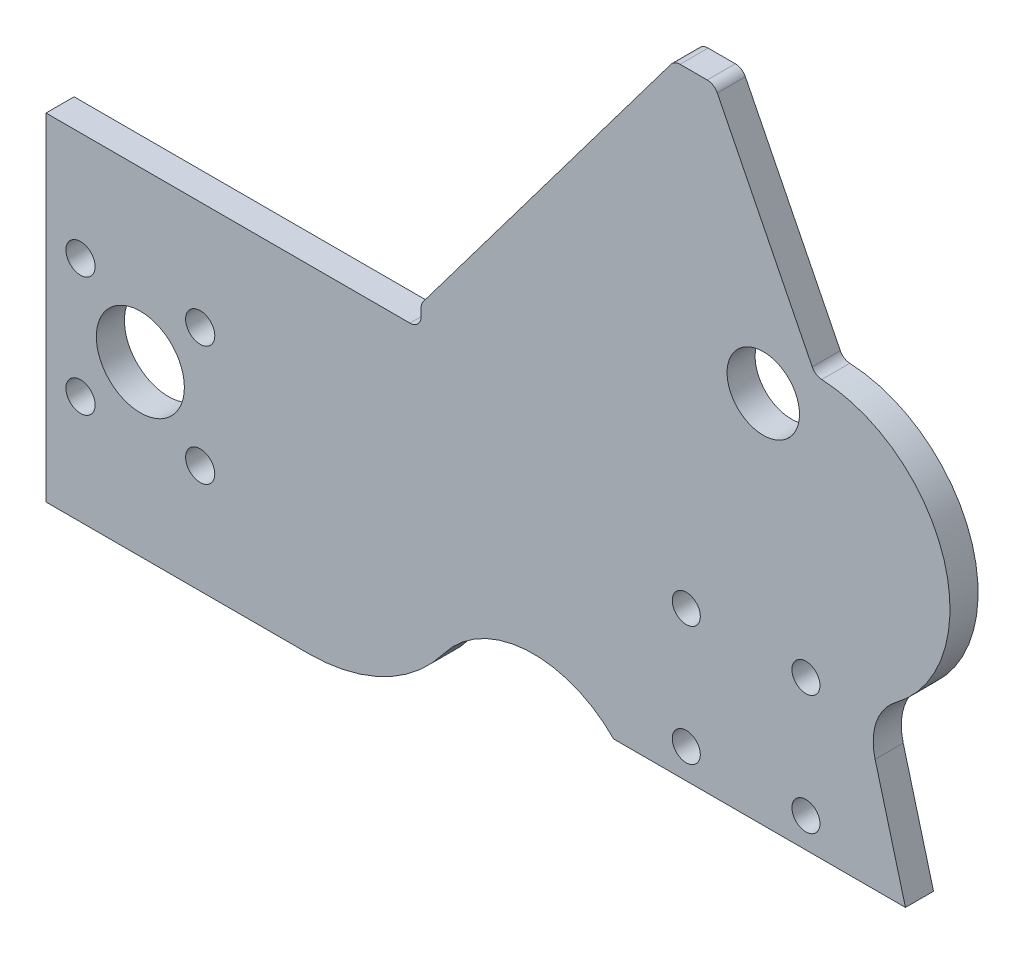
ISO-10303-21;
HEADER;
FILE_DESCRIPTION(('STEP AP214'),'2;1');
FILE_NAME('part.step','',(''),(''),'','','');
FILE_SCHEMA(('AUTOMOTIVE_DESIGN { 1 0 10303 214 1 1 1 1 }'));
ENDSEC;
DATA;
#1=APPLICATION_CONTEXT('core data for automotive mechanical design processes');
#2=APPLICATION_PROTOCOL_DEFINITION('international standard','automotive_design',2000,#1);
#3=PRODUCT_CONTEXT('',#1,'mechanical');
#4=PRODUCT('Part','Part','',(#3));
#5=PRODUCT_RELATED_PRODUCT_CATEGORY('part','',(#4));
#6=PRODUCT_DEFINITION_FORMATION('','',#4);
#7=PRODUCT_DEFINITION_CONTEXT('part definition',#1,'design');
#8=PRODUCT_DEFINITION('design','',#6,#7);
#9=PRODUCT_DEFINITION_SHAPE('','',#8);
#10=(LENGTH_UNIT() NAMED_UNIT(*) SI_UNIT(.MILLI.,.METRE.));
#11=(NAMED_UNIT(*) PLANE_ANGLE_UNIT() SI_UNIT($,.RADIAN.));
#12=(NAMED_UNIT(*) SI_UNIT($,.STERADIAN.) SOLID_ANGLE_UNIT());
#13=UNCERTAINTY_MEASURE_WITH_UNIT(LENGTH_MEASURE(1.E-05),#10,'distance_accuracy_value','');
#14=(GEOMETRIC_REPRESENTATION_CONTEXT(3) GLOBAL_UNCERTAINTY_ASSIGNED_CONTEXT((#13)) GLOBAL_UNIT_ASSIGNED_CONTEXT((#10,
#11,#12)) REPRESENTATION_CONTEXT('',''));
#15=CARTESIAN_POINT('',(0.,0.,0.));
#16=DIRECTION('',(0.,0.,1.));
#17=DIRECTION('',(1.,0.,0.));
#18=AXIS2_PLACEMENT_3D('',#15,#16,#17);
#19=CARTESIAN_POINT('',(95.3674532925549,40.64,3.175));
#20=DIRECTION('',(0.,0.,1.));
#21=DIRECTION('',(1.,0.,0.));
#22=AXIS2_PLACEMENT_3D('',#19,#20,#21);
#23=PLANE('',#22);
#24=CARTESIAN_POINT('',(12.2829881040448,12.2829881040447,3.175));
#25=DIRECTION('',(0.,0.,1.));
#26=DIRECTION('',(-1.,0.,0.));
#27=AXIS2_PLACEMENT_3D('',#24,#25,#26);
#28=CIRCLE('',#27,1.65099999999998);
#29=CARTESIAN_POINT('',(10.6319881040448,12.2829881040447,3.175));
#30=VERTEX_POINT('',#29);
#31=EDGE_CURVE('E535',#30,#30,#28,.T.);
#32=ORIENTED_EDGE('',*,*,#31,.F.);
#33=EDGE_LOOP('',(#32));
#34=FACE_BOUND('',#33,.T.);
#35=CARTESIAN_POINT('',(12.2829881040447,25.8170118959552,3.175));
#36=DIRECTION('',(0.,0.,1.));
#37=DIRECTION('',(-1.,0.,0.));
#38=AXIS2_PLACEMENT_3D('',#35,#36,#37);
#39=CIRCLE('',#38,1.65099999999998);
#40=CARTESIAN_POINT('',(10.6319881040448,25.8170118959552,3.175));
#41=VERTEX_POINT('',#40);
#42=EDGE_CURVE('E536',#41,#41,#39,.T.);
#43=ORIENTED_EDGE('',*,*,#42,.F.);
#44=EDGE_LOOP('',(#43));
#45=FACE_BOUND('',#44,.T.);
#46=DIRECTION('',(-0.447435675298308,0.894316116633457,0.));
#47=VECTOR('',#46,1.);
#48=CARTESIAN_POINT('',(83.9405966938323,78.7195333293076,3.175));
#49=LINE('',#48,#47);
#50=CARTESIAN_POINT('',(95.025920835087,56.5626410988871,3.175));
#51=VERTEX_POINT('',#50);
#52=CARTESIAN_POINT('',(84.2916928819768,78.0177766369365,3.175));
#53=VERTEX_POINT('',#52);
#54=EDGE_CURVE('E413',#51,#53,#49,.T.);
#55=ORIENTED_EDGE('',*,*,#54,.T.);
#56=CARTESIAN_POINT('',(83.1559114138523,77.4495333293076,3.175));
#57=DIRECTION('',(0.,0.,1.));
#58=DIRECTION('',(1.,0.,0.));
#59=AXIS2_PLACEMENT_3D('',#56,#57,#58);
#60=CIRCLE('',#59,1.27);
#61=CARTESIAN_POINT('',(83.1559114138523,78.7195333293076,3.175));
#62=VERTEX_POINT('',#61);
#63=EDGE_CURVE('E384',#53,#62,#60,.T.);
#64=ORIENTED_EDGE('',*,*,#63,.T.);
#65=DIRECTION('',(-1.,0.,0.));
#66=VECTOR('',#65,1.);
#67=CARTESIAN_POINT('',(79.4434221941756,78.7195333293077,3.175));
#68=LINE('',#67,#66);
#69=CARTESIAN_POINT('',(80.0773062030265,78.7195333293077,3.175));
#70=VERTEX_POINT('',#69);
#71=EDGE_CURVE('E226',#62,#70,#68,.T.);
#72=ORIENTED_EDGE('',*,*,#71,.T.);
#73=CARTESIAN_POINT('',(80.0773062030265,77.4495333293077,3.175));
#74=DIRECTION('',(0.,0.,1.));
#75=DIRECTION('',(1.,0.,0.));
#76=AXIS2_PLACEMENT_3D('',#73,#74,#75);
#77=CIRCLE('',#76,1.27);
#78=CARTESIAN_POINT('',(79.0623789356049,78.2129615458704,3.175));
#79=VERTEX_POINT('',#78);
#80=EDGE_CURVE('E268',#70,#79,#77,.T.);
#81=ORIENTED_EDGE('',*,*,#80,.T.);
#82=DIRECTION('',(-0.601124579970693,-0.799155328678385,0.));
#83=VECTOR('',#82,1.);
#84=CARTESIAN_POINT('',(50.8000000000001,40.64,3.175));
#85=LINE('',#84,#83);
#86=CARTESIAN_POINT('',(51.0550727325785,40.9791023096253,3.175));
#87=VERTEX_POINT('',#86);
#88=EDGE_CURVE('E378',#79,#87,#85,.T.);
#89=ORIENTED_EDGE('',*,*,#88,.T.);
#90=CARTESIAN_POINT('',(52.07,40.2156740930625,3.175));
#91=DIRECTION('',(0.,0.,1.));
#92=DIRECTION('',(1.,0.,0.));
#93=AXIS2_PLACEMENT_3D('',#90,#91,#92);
#94=CIRCLE('',#93,1.27);
#95=CARTESIAN_POINT('',(50.8,40.2156740930625,3.175));
#96=VERTEX_POINT('',#95);
#97=EDGE_CURVE('E265',#87,#96,#94,.T.);
#98=ORIENTED_EDGE('',*,*,#97,.T.);
#99=DIRECTION('',(0.,1.,0.));
#100=VECTOR('',#99,1.);
#101=CARTESIAN_POINT('',(50.8,38.1,3.175));
#102=LINE('',#101,#100);
#103=CARTESIAN_POINT('',(50.8,39.37,3.175));
#104=VERTEX_POINT('',#103);
#105=EDGE_CURVE('E276',#104,#96,#102,.T.);
#106=ORIENTED_EDGE('',*,*,#105,.F.);
#107=CARTESIAN_POINT('',(49.53,39.37,3.175));
#108=DIRECTION('',(0.,0.,1.));
#109=DIRECTION('',(1.,0.,0.));
#110=AXIS2_PLACEMENT_3D('',#107,#108,#109);
#111=CIRCLE('',#110,1.27);
#112=CARTESIAN_POINT('',(49.53,38.1,3.175));
#113=VERTEX_POINT('',#112);
#114=EDGE_CURVE('E50',#104,#113,#111,.F.);
#115=ORIENTED_EDGE('',*,*,#114,.T.);
#116=DIRECTION('',(1.,0.,0.));
#117=VECTOR('',#116,1.);
#118=CARTESIAN_POINT('',(0.,38.1,3.175));
#119=LINE('',#118,#117);
#120=CARTESIAN_POINT('',(8.382,38.1,3.175));
#121=VERTEX_POINT('',#120);
#122=EDGE_CURVE('E281',#121,#113,#119,.T.);
#123=ORIENTED_EDGE('',*,*,#122,.F.);
#124=DIRECTION('',(0.,-1.,0.));
#125=VECTOR('',#124,1.);
#126=CARTESIAN_POINT('',(8.382,38.1,3.175));
#127=LINE('',#126,#125);
#128=CARTESIAN_POINT('',(8.382,0.,3.175));
#129=VERTEX_POINT('',#128);
#130=EDGE_CURVE('E223',#121,#129,#127,.T.);
#131=ORIENTED_EDGE('',*,*,#130,.T.);
#132=DIRECTION('',(1.,0.,0.));
#133=VECTOR('',#132,1.);
#134=CARTESIAN_POINT('',(0.,0.,3.175));
#135=LINE('',#134,#133);
#136=CARTESIAN_POINT('',(38.1,0.,3.175));
#137=VERTEX_POINT('',#136);
#138=EDGE_CURVE('E193',#129,#137,#135,.T.);
#139=ORIENTED_EDGE('',*,*,#138,.T.);
#140=CARTESIAN_POINT('',(38.1,19.05,3.175));
#141=DIRECTION('',(0.,0.,1.));
#142=DIRECTION('',(1.,0.,0.));
#143=AXIS2_PLACEMENT_3D('',#140,#141,#142);
#144=CIRCLE('',#143,19.05);
#145=CARTESIAN_POINT('',(53.34,7.62,3.175));
#146=VERTEX_POINT('',#145);
#147=EDGE_CURVE('E240',#137,#146,#144,.T.);
#148=ORIENTED_EDGE('',*,*,#147,.T.);
#149=CARTESIAN_POINT('',(63.5,0.,3.175));
#150=DIRECTION('',(0.,0.,1.));
#151=DIRECTION('',(1.,0.,0.));
#152=AXIS2_PLACEMENT_3D('',#149,#150,#151);
#153=CIRCLE('',#152,12.7);
#154=CARTESIAN_POINT('',(72.5696141042494,8.88999999999999,3.175));
#155=VERTEX_POINT('',#154);
#156=EDGE_CURVE('E185',#155,#146,#153,.T.);
#157=ORIENTED_EDGE('',*,*,#156,.F.);
#158=DIRECTION('',(-1.,0.,0.));
#159=VECTOR('',#158,1.);
#160=CARTESIAN_POINT('',(64.058492054823,8.89,3.175));
#161=LINE('',#160,#159);
#162=CARTESIAN_POINT('',(105.567931679286,8.89,3.175));
#163=VERTEX_POINT('',#162);
#164=EDGE_CURVE('E169',#163,#155,#161,.T.);
#165=ORIENTED_EDGE('',*,*,#164,.F.);
#166=DIRECTION('',(-0.258819045102525,0.965925826289067,0.));
#167=VECTOR('',#166,1.);
#168=CARTESIAN_POINT('',(107.95,0.,3.175));
#169=LINE('',#168,#167);
#170=CARTESIAN_POINT('',(102.138767467486,21.6878150659382,3.175));
#171=VERTEX_POINT('',#170);
#172=EDGE_CURVE('E182',#163,#171,#169,.T.);
#173=ORIENTED_EDGE('',*,*,#172,.T.);
#174=CARTESIAN_POINT('',(108.272396464422,23.3313160023389,3.175));
#175=DIRECTION('',(0.,0.,1.));
#176=DIRECTION('',(1.,0.,0.));
#177=AXIS2_PLACEMENT_3D('',#174,#175,#176);
#178=CIRCLE('',#177,6.35);
#179=CARTESIAN_POINT('',(104.476824943284,28.4221054134157,3.175));
#180=VERTEX_POINT('',#179);
#181=EDGE_CURVE('E433',#171,#180,#178,.F.);
#182=ORIENTED_EDGE('',*,*,#181,.T.);
#183=CARTESIAN_POINT('',(95.3674532925549,40.64,3.175));
#184=DIRECTION('',(0.,0.,1.));
#185=DIRECTION('',(1.,0.,0.));
#186=AXIS2_PLACEMENT_3D('',#183,#184,#185);
#187=CIRCLE('',#186,15.24);
#188=CARTESIAN_POINT('',(96.1006062254687,55.862354836784,3.175));
#189=VERTEX_POINT('',#188);
#190=EDGE_CURVE('E192',#180,#189,#187,.T.);
#191=ORIENTED_EDGE('',*,*,#190,.T.);
#192=CARTESIAN_POINT('',(96.1617023032115,57.130884406516,3.175));
#193=DIRECTION('',(0.,0.,1.));
#194=DIRECTION('',(1.,0.,0.));
#195=AXIS2_PLACEMENT_3D('',#192,#193,#194);
#196=CIRCLE('',#195,1.27);
#197=EDGE_CURVE('E410',#189,#51,#196,.F.);
#198=ORIENTED_EDGE('',*,*,#197,.T.);
#199=EDGE_LOOP('',(#55,#64,#72,#81,#89,#98,#106,#115,#123,#131,#139,#148,#157,#165,#173,#182,
#191,#198));
#200=FACE_BOUND('',#199,.T.);
#201=CARTESIAN_POINT('',(89.4900039632138,51.1876405384612,3.175));
#202=DIRECTION('',(0.,0.,1.));
#203=DIRECTION('',(1.,0.,0.));
#204=AXIS2_PLACEMENT_3D('',#201,#202,#203);
#205=CIRCLE('',#204,4.09575000000001);
#206=CARTESIAN_POINT('',(93.5857539632138,51.1876405384612,3.175));
#207=VERTEX_POINT('',#206);
#208=EDGE_CURVE('E176',#207,#207,#205,.T.);
#209=ORIENTED_EDGE('',*,*,#208,.F.);
#210=EDGE_LOOP('',(#209));
#211=FACE_BOUND('',#210,.T.);
#212=CARTESIAN_POINT('',(19.05,19.05,3.175));
#213=DIRECTION('',(0.,0.,1.));
#214=DIRECTION('',(1.,0.,0.));
#215=AXIS2_PLACEMENT_3D('',#212,#213,#214);
#216=CIRCLE('',#215,4.9784);
#217=CARTESIAN_POINT('',(24.0284,19.05,3.175));
#218=VERTEX_POINT('',#217);
#219=EDGE_CURVE('E291',#218,#218,#216,.T.);
#220=ORIENTED_EDGE('',*,*,#219,.F.);
#221=EDGE_LOOP('',(#220));
#222=FACE_BOUND('',#221,.T.);
#223=CARTESIAN_POINT('',(80.7828839632111,12.2536167465507,3.175));
#224=DIRECTION('',(0.,0.,1.));
#225=DIRECTION('',(1.,0.,0.));
#226=AXIS2_PLACEMENT_3D('',#223,#224,#225);
#227=CIRCLE('',#226,1.5875);
#228=CARTESIAN_POINT('',(82.3703839632111,12.2536167465507,3.175));
#229=VERTEX_POINT('',#228);
#230=EDGE_CURVE('E298',#229,#229,#227,.T.);
#231=ORIENTED_EDGE('',*,*,#230,.F.);
#232=EDGE_LOOP('',(#231));
#233=FACE_BOUND('',#232,.T.);
#234=CARTESIAN_POINT('',(94.3160039632111,12.2536167465506,3.175));
#235=DIRECTION('',(0.,0.,1.));
#236=DIRECTION('',(1.,0.,0.));
#237=AXIS2_PLACEMENT_3D('',#234,#235,#236);
#238=CIRCLE('',#237,1.5875);
#239=CARTESIAN_POINT('',(95.9035039632111,12.2536167465506,3.175));
#240=VERTEX_POINT('',#239);
#241=EDGE_CURVE('E308',#240,#240,#238,.T.);
#242=ORIENTED_EDGE('',*,*,#241,.F.);
#243=EDGE_LOOP('',(#242));
#244=FACE_BOUND('',#243,.T.);
#245=CARTESIAN_POINT('',(80.7828839632111,25.7876405384612,3.175));
#246=DIRECTION('',(0.,0.,1.));
#247=DIRECTION('',(1.,0.,0.));
#248=AXIS2_PLACEMENT_3D('',#245,#246,#247);
#249=CIRCLE('',#248,1.5875);
#250=CARTESIAN_POINT('',(82.3703839632111,25.7876405384612,3.175));
#251=VERTEX_POINT('',#250);
#252=EDGE_CURVE('E314',#251,#251,#249,.T.);
#253=ORIENTED_EDGE('',*,*,#252,.F.);
#254=EDGE_LOOP('',(#253));
#255=FACE_BOUND('',#254,.T.);
#256=CARTESIAN_POINT('',(94.3160039632138,25.7876405384612,3.175));
#257=DIRECTION('',(0.,0.,1.));
#258=DIRECTION('',(1.,0.,0.));
#259=AXIS2_PLACEMENT_3D('',#256,#257,#258);
#260=CIRCLE('',#259,1.5875);
#261=CARTESIAN_POINT('',(95.9035039632138,25.7876405384612,3.175));
#262=VERTEX_POINT('',#261);
#263=EDGE_CURVE('E288',#262,#262,#260,.T.);
#264=ORIENTED_EDGE('',*,*,#263,.F.);
#265=EDGE_LOOP('',(#264));
#266=FACE_BOUND('',#265,.T.);
#267=CARTESIAN_POINT('',(25.8170118959553,25.8170118959552,3.175));
#268=DIRECTION('',(0.,0.,1.));
#269=DIRECTION('',(1.,0.,0.));
#270=AXIS2_PLACEMENT_3D('',#267,#268,#269);
#271=CIRCLE('',#270,1.65099999999998);
#272=CARTESIAN_POINT('',(27.4680118959552,25.8170118959552,3.175));
#273=VERTEX_POINT('',#272);
#274=EDGE_CURVE('E326',#273,#273,#271,.T.);
#275=ORIENTED_EDGE('',*,*,#274,.F.);
#276=EDGE_LOOP('',(#275));
#277=FACE_BOUND('',#276,.T.);
#278=CARTESIAN_POINT('',(25.8170118959553,12.2829881040447,3.175));
#279=DIRECTION('',(0.,0.,1.));
#280=DIRECTION('',(1.,0.,0.));
#281=AXIS2_PLACEMENT_3D('',#278,#279,#280);
#282=CIRCLE('',#281,1.65099999999998);
#283=CARTESIAN_POINT('',(27.4680118959552,12.2829881040447,3.175));
#284=VERTEX_POINT('',#283);
#285=EDGE_CURVE('E334',#284,#284,#282,.T.);
#286=ORIENTED_EDGE('',*,*,#285,.F.);
#287=EDGE_LOOP('',(#286));
#288=FACE_BOUND('',#287,.T.);
#289=ADVANCED_FACE('F42',(#34,#45,#200,#211,#222,#233,#244,#255,#266,#277,#288),#23,.T.);
#290=CARTESIAN_POINT('',(95.3674532925549,40.64,0.));
#291=DIRECTION('',(0.,0.,1.));
#292=DIRECTION('',(1.,0.,0.));
#293=AXIS2_PLACEMENT_3D('',#290,#291,#292);
#294=PLANE('',#293);
#295=CARTESIAN_POINT('',(12.2829881040448,12.2829881040447,0.));
#296=DIRECTION('',(0.,0.,1.));
#297=DIRECTION('',(-1.,0.,0.));
#298=AXIS2_PLACEMENT_3D('',#295,#296,#297);
#299=CIRCLE('',#298,1.65099999999998);
#300=CARTESIAN_POINT('',(10.6319881040448,12.2829881040447,0.));
#301=VERTEX_POINT('',#300);
#302=EDGE_CURVE('E186',#301,#301,#299,.T.);
#303=ORIENTED_EDGE('',*,*,#302,.T.);
#304=EDGE_LOOP('',(#303));
#305=FACE_BOUND('',#304,.T.);
#306=CARTESIAN_POINT('',(12.2829881040447,25.8170118959552,0.));
#307=DIRECTION('',(0.,0.,1.));
#308=DIRECTION('',(-1.,0.,0.));
#309=AXIS2_PLACEMENT_3D('',#306,#307,#308);
#310=CIRCLE('',#309,1.65099999999998);
#311=CARTESIAN_POINT('',(10.6319881040448,25.8170118959552,0.));
#312=VERTEX_POINT('',#311);
#313=EDGE_CURVE('E540',#312,#312,#310,.T.);
#314=ORIENTED_EDGE('',*,*,#313,.T.);
#315=EDGE_LOOP('',(#314));
#316=FACE_BOUND('',#315,.T.);
#317=CARTESIAN_POINT('',(89.4900039632138,51.1876405384612,0.));
#318=DIRECTION('',(0.,0.,1.));
#319=DIRECTION('',(1.,0.,0.));
#320=AXIS2_PLACEMENT_3D('',#317,#318,#319);
#321=CIRCLE('',#320,4.09575000000001);
#322=CARTESIAN_POINT('',(93.5857539632138,51.1876405384612,0.));
#323=VERTEX_POINT('',#322);
#324=EDGE_CURVE('E218',#323,#323,#321,.T.);
#325=ORIENTED_EDGE('',*,*,#324,.T.);
#326=EDGE_LOOP('',(#325));
#327=FACE_BOUND('',#326,.T.);
#328=CARTESIAN_POINT('',(25.8170118959553,12.2829881040447,0.));
#329=DIRECTION('',(0.,0.,1.));
#330=DIRECTION('',(1.,0.,0.));
#331=AXIS2_PLACEMENT_3D('',#328,#329,#330);
#332=CIRCLE('',#331,1.65099999999998);
#333=CARTESIAN_POINT('',(27.4680118959552,12.2829881040447,0.));
#334=VERTEX_POINT('',#333);
#335=EDGE_CURVE('E332',#334,#334,#332,.T.);
#336=ORIENTED_EDGE('',*,*,#335,.T.);
#337=EDGE_LOOP('',(#336));
#338=FACE_BOUND('',#337,.T.);
#339=CARTESIAN_POINT('',(25.8170118959553,25.8170118959552,0.));
#340=DIRECTION('',(0.,0.,1.));
#341=DIRECTION('',(1.,0.,0.));
#342=AXIS2_PLACEMENT_3D('',#339,#340,#341);
#343=CIRCLE('',#342,1.65099999999998);
#344=CARTESIAN_POINT('',(27.4680118959552,25.8170118959552,0.));
#345=VERTEX_POINT('',#344);
#346=EDGE_CURVE('E331',#345,#345,#343,.T.);
#347=ORIENTED_EDGE('',*,*,#346,.T.);
#348=EDGE_LOOP('',(#347));
#349=FACE_BOUND('',#348,.T.);
#350=CARTESIAN_POINT('',(94.3160039632138,25.7876405384612,0.));
#351=DIRECTION('',(0.,0.,1.));
#352=DIRECTION('',(1.,0.,0.));
#353=AXIS2_PLACEMENT_3D('',#350,#351,#352);
#354=CIRCLE('',#353,1.5875);
#355=CARTESIAN_POINT('',(95.9035039632138,25.7876405384612,0.));
#356=VERTEX_POINT('',#355);
#357=EDGE_CURVE('E318',#356,#356,#354,.T.);
#358=ORIENTED_EDGE('',*,*,#357,.T.);
#359=EDGE_LOOP('',(#358));
#360=FACE_BOUND('',#359,.T.);
#361=CARTESIAN_POINT('',(80.7828839632111,25.7876405384612,0.));
#362=DIRECTION('',(0.,0.,1.));
#363=DIRECTION('',(1.,0.,0.));
#364=AXIS2_PLACEMENT_3D('',#361,#362,#363);
#365=CIRCLE('',#364,1.5875);
#366=CARTESIAN_POINT('',(82.3703839632111,25.7876405384612,0.));
#367=VERTEX_POINT('',#366);
#368=EDGE_CURVE('E312',#367,#367,#365,.T.);
#369=ORIENTED_EDGE('',*,*,#368,.T.);
#370=EDGE_LOOP('',(#369));
#371=FACE_BOUND('',#370,.T.);
#372=CARTESIAN_POINT('',(94.3160039632111,12.2536167465506,0.));
#373=DIRECTION('',(0.,0.,1.));
#374=DIRECTION('',(1.,0.,0.));
#375=AXIS2_PLACEMENT_3D('',#372,#373,#374);
#376=CIRCLE('',#375,1.5875);
#377=CARTESIAN_POINT('',(95.9035039632111,12.2536167465506,0.));
#378=VERTEX_POINT('',#377);
#379=EDGE_CURVE('E302',#378,#378,#376,.T.);
#380=ORIENTED_EDGE('',*,*,#379,.T.);
#381=EDGE_LOOP('',(#380));
#382=FACE_BOUND('',#381,.T.);
#383=CARTESIAN_POINT('',(80.7828839632111,12.2536167465507,0.));
#384=DIRECTION('',(0.,0.,1.));
#385=DIRECTION('',(1.,0.,0.));
#386=AXIS2_PLACEMENT_3D('',#383,#384,#385);
#387=CIRCLE('',#386,1.5875);
#388=CARTESIAN_POINT('',(82.3703839632111,12.2536167465507,0.));
#389=VERTEX_POINT('',#388);
#390=EDGE_CURVE('E295',#389,#389,#387,.T.);
#391=ORIENTED_EDGE('',*,*,#390,.T.);
#392=EDGE_LOOP('',(#391));
#393=FACE_BOUND('',#392,.T.);
#394=CARTESIAN_POINT('',(19.05,19.05,0.));
#395=DIRECTION('',(0.,0.,1.));
#396=DIRECTION('',(1.,0.,0.));
#397=AXIS2_PLACEMENT_3D('',#394,#395,#396);
#398=CIRCLE('',#397,4.9784);
#399=CARTESIAN_POINT('',(24.0284,19.05,0.));
#400=VERTEX_POINT('',#399);
#401=EDGE_CURVE('E289',#400,#400,#398,.T.);
#402=ORIENTED_EDGE('',*,*,#401,.T.);
#403=EDGE_LOOP('',(#402));
#404=FACE_BOUND('',#403,.T.);
#405=DIRECTION('',(-1.,0.,0.));
#406=VECTOR('',#405,1.);
#407=CARTESIAN_POINT('',(79.4434221941756,78.7195333293077,0.));
#408=LINE('',#407,#406);
#409=CARTESIAN_POINT('',(83.1559114138523,78.7195333293076,0.));
#410=VERTEX_POINT('',#409);
#411=CARTESIAN_POINT('',(80.0773062030265,78.7195333293077,0.));
#412=VERTEX_POINT('',#411);
#413=EDGE_CURVE('E230',#410,#412,#408,.T.);
#414=ORIENTED_EDGE('',*,*,#413,.F.);
#415=CARTESIAN_POINT('',(83.1559114138523,77.4495333293076,0.));
#416=DIRECTION('',(0.,0.,1.));
#417=DIRECTION('',(1.,0.,0.));
#418=AXIS2_PLACEMENT_3D('',#415,#416,#417);
#419=CIRCLE('',#418,1.27);
#420=CARTESIAN_POINT('',(84.2916928819768,78.0177766369365,0.));
#421=VERTEX_POINT('',#420);
#422=EDGE_CURVE('E395',#410,#421,#419,.F.);
#423=ORIENTED_EDGE('',*,*,#422,.T.);
#424=DIRECTION('',(-0.447435675298308,0.894316116633457,0.));
#425=VECTOR('',#424,1.);
#426=CARTESIAN_POINT('',(83.9405966938323,78.7195333293076,0.));
#427=LINE('',#426,#425);
#428=CARTESIAN_POINT('',(95.025920835087,56.5626410988871,0.));
#429=VERTEX_POINT('',#428);
#430=EDGE_CURVE('E368',#429,#421,#427,.T.);
#431=ORIENTED_EDGE('',*,*,#430,.F.);
#432=CARTESIAN_POINT('',(96.1617023032115,57.130884406516,0.));
#433=DIRECTION('',(0.,0.,1.));
#434=DIRECTION('',(1.,0.,0.));
#435=AXIS2_PLACEMENT_3D('',#432,#433,#434);
#436=CIRCLE('',#435,1.27);
#437=CARTESIAN_POINT('',(96.1006062254687,55.862354836784,0.));
#438=VERTEX_POINT('',#437);
#439=EDGE_CURVE('E408',#429,#438,#436,.T.);
#440=ORIENTED_EDGE('',*,*,#439,.T.);
#441=CARTESIAN_POINT('',(95.3674532925549,40.64,0.));
#442=DIRECTION('',(0.,0.,1.));
#443=DIRECTION('',(1.,0.,0.));
#444=AXIS2_PLACEMENT_3D('',#441,#442,#443);
#445=CIRCLE('',#444,15.24);
#446=CARTESIAN_POINT('',(104.476824943284,28.4221054134157,0.));
#447=VERTEX_POINT('',#446);
#448=EDGE_CURVE('E198',#447,#438,#445,.T.);
#449=ORIENTED_EDGE('',*,*,#448,.F.);
#450=CARTESIAN_POINT('',(108.272396464422,23.3313160023389,0.));
#451=DIRECTION('',(0.,0.,1.));
#452=DIRECTION('',(1.,0.,0.));
#453=AXIS2_PLACEMENT_3D('',#450,#451,#452);
#454=CIRCLE('',#453,6.35);
#455=CARTESIAN_POINT('',(102.138767467486,21.6878150659382,0.));
#456=VERTEX_POINT('',#455);
#457=EDGE_CURVE('E432',#447,#456,#454,.T.);
#458=ORIENTED_EDGE('',*,*,#457,.T.);
#459=DIRECTION('',(-0.258819045102477,0.96592582628908,0.));
#460=VECTOR('',#459,1.);
#461=CARTESIAN_POINT('',(100.936260599847,26.1756317924197,0.));
#462=LINE('',#461,#460);
#463=CARTESIAN_POINT('',(105.567931679286,8.89,0.));
#464=VERTEX_POINT('',#463);
#465=EDGE_CURVE('E358',#464,#456,#462,.T.);
#466=ORIENTED_EDGE('',*,*,#465,.F.);
#467=DIRECTION('',(-1.,0.,0.));
#468=VECTOR('',#467,1.);
#469=CARTESIAN_POINT('',(64.058492054823,8.89,0.));
#470=LINE('',#469,#468);
#471=CARTESIAN_POINT('',(72.5696141042494,8.89,0.));
#472=VERTEX_POINT('',#471);
#473=EDGE_CURVE('E172',#464,#472,#470,.T.);
#474=ORIENTED_EDGE('',*,*,#473,.T.);
#475=CARTESIAN_POINT('',(63.5,0.,0.));
#476=DIRECTION('',(0.,0.,1.));
#477=DIRECTION('',(1.,0.,0.));
#478=AXIS2_PLACEMENT_3D('',#475,#476,#477);
#479=CIRCLE('',#478,12.7);
#480=CARTESIAN_POINT('',(53.34,7.62,0.));
#481=VERTEX_POINT('',#480);
#482=EDGE_CURVE('E341',#472,#481,#479,.T.);
#483=ORIENTED_EDGE('',*,*,#482,.T.);
#484=CARTESIAN_POINT('',(38.1,19.05,0.));
#485=DIRECTION('',(0.,0.,1.));
#486=DIRECTION('',(1.,0.,0.));
#487=AXIS2_PLACEMENT_3D('',#484,#485,#486);
#488=CIRCLE('',#487,19.05);
#489=CARTESIAN_POINT('',(38.1,0.,0.));
#490=VERTEX_POINT('',#489);
#491=EDGE_CURVE('E249',#481,#490,#488,.F.);
#492=ORIENTED_EDGE('',*,*,#491,.T.);
#493=DIRECTION('',(1.,0.,0.));
#494=VECTOR('',#493,1.);
#495=CARTESIAN_POINT('',(0.,0.,0.));
#496=LINE('',#495,#494);
#497=CARTESIAN_POINT('',(8.382,0.,0.));
#498=VERTEX_POINT('',#497);
#499=EDGE_CURVE('E330',#498,#490,#496,.T.);
#500=ORIENTED_EDGE('',*,*,#499,.F.);
#501=DIRECTION('',(0.,-1.,0.));
#502=VECTOR('',#501,1.);
#503=CARTESIAN_POINT('',(8.382,38.1,0.));
#504=LINE('',#503,#502);
#505=CARTESIAN_POINT('',(8.382,38.1,0.));
#506=VERTEX_POINT('',#505);
#507=EDGE_CURVE('E222',#506,#498,#504,.T.);
#508=ORIENTED_EDGE('',*,*,#507,.F.);
#509=DIRECTION('',(1.,0.,0.));
#510=VECTOR('',#509,1.);
#511=CARTESIAN_POINT('',(95.3674532925549,38.1,0.));
#512=LINE('',#511,#510);
#513=CARTESIAN_POINT('',(49.53,38.1,0.));
#514=VERTEX_POINT('',#513);
#515=EDGE_CURVE('E280',#506,#514,#512,.T.);
#516=ORIENTED_EDGE('',*,*,#515,.T.);
#517=CARTESIAN_POINT('',(49.53,39.37,0.));
#518=DIRECTION('',(0.,0.,1.));
#519=DIRECTION('',(1.,0.,0.));
#520=AXIS2_PLACEMENT_3D('',#517,#518,#519);
#521=CIRCLE('',#520,1.27);
#522=CARTESIAN_POINT('',(50.8,39.37,0.));
#523=VERTEX_POINT('',#522);
#524=EDGE_CURVE('E12',#514,#523,#521,.T.);
#525=ORIENTED_EDGE('',*,*,#524,.T.);
#526=DIRECTION('',(0.,1.,0.));
#527=VECTOR('',#526,1.);
#528=CARTESIAN_POINT('',(50.8,40.64,0.));
#529=LINE('',#528,#527);
#530=CARTESIAN_POINT('',(50.8,40.2156740930625,0.));
#531=VERTEX_POINT('',#530);
#532=EDGE_CURVE('E286',#523,#531,#529,.T.);
#533=ORIENTED_EDGE('',*,*,#532,.T.);
#534=CARTESIAN_POINT('',(52.07,40.2156740930625,0.));
#535=DIRECTION('',(0.,0.,1.));
#536=DIRECTION('',(1.,0.,0.));
#537=AXIS2_PLACEMENT_3D('',#534,#535,#536);
#538=CIRCLE('',#537,1.27);
#539=CARTESIAN_POINT('',(51.0550727325785,40.9791023096253,0.));
#540=VERTEX_POINT('',#539);
#541=EDGE_CURVE('E57',#531,#540,#538,.F.);
#542=ORIENTED_EDGE('',*,*,#541,.T.);
#543=DIRECTION('',(-0.601124579970693,-0.799155328678385,0.));
#544=VECTOR('',#543,1.);
#545=CARTESIAN_POINT('',(50.8000000000001,40.64,0.));
#546=LINE('',#545,#544);
#547=CARTESIAN_POINT('',(79.0623789356049,78.2129615458704,0.));
#548=VERTEX_POINT('',#547);
#549=EDGE_CURVE('E370',#548,#540,#546,.T.);
#550=ORIENTED_EDGE('',*,*,#549,.F.);
#551=CARTESIAN_POINT('',(80.0773062030265,77.4495333293077,0.));
#552=DIRECTION('',(0.,0.,1.));
#553=DIRECTION('',(1.,0.,0.));
#554=AXIS2_PLACEMENT_3D('',#551,#552,#553);
#555=CIRCLE('',#554,1.27);
#556=EDGE_CURVE('E393',#548,#412,#555,.F.);
#557=ORIENTED_EDGE('',*,*,#556,.T.);
#558=EDGE_LOOP('',(#414,#423,#431,#440,#449,#458,#466,#474,#483,#492,#500,#508,#516,#525,#533,
#542,#550,#557));
#559=FACE_BOUND('',#558,.T.);
#560=ADVANCED_FACE('F355',(#305,#316,#327,#338,#349,#360,#371,#382,#393,#404,#559),#294,.F.);
#561=CARTESIAN_POINT('',(0.,38.1,-47.625));
#562=DIRECTION('',(0.,-1.,0.));
#563=DIRECTION('',(0.,0.,-1.));
#564=AXIS2_PLACEMENT_3D('',#561,#562,#563);
#565=PLANE('',#564);
#566=ORIENTED_EDGE('',*,*,#122,.T.);
#567=DIRECTION('',(0.,0.,1.));
#568=VECTOR('',#567,1.);
#569=CARTESIAN_POINT('',(49.53,38.1,0.));
#570=LINE('',#569,#568);
#571=EDGE_CURVE('E406',#113,#514,#570,.F.);
#572=ORIENTED_EDGE('',*,*,#571,.T.);
#573=ORIENTED_EDGE('',*,*,#515,.F.);
#574=DIRECTION('',(0.,0.,-1.));
#575=VECTOR('',#574,1.);
#576=CARTESIAN_POINT('',(8.382,38.1,3.175));
#577=LINE('',#576,#575);
#578=EDGE_CURVE('E219',#121,#506,#577,.T.);
#579=ORIENTED_EDGE('',*,*,#578,.F.);
#580=EDGE_LOOP('',(#566,#572,#573,#579));
#581=FACE_BOUND('',#580,.T.);
#582=ADVANCED_FACE('F365',(#581),#565,.F.);
#583=CARTESIAN_POINT('',(0.,0.,3.175));
#584=DIRECTION('',(0.,1.,0.));
#585=DIRECTION('',(0.,0.,1.));
#586=AXIS2_PLACEMENT_3D('',#583,#584,#585);
#587=PLANE('',#586);
#588=DIRECTION('',(0.,0.,1.));
#589=VECTOR('',#588,1.);
#590=CARTESIAN_POINT('',(8.382,0.,3.175));
#591=LINE('',#590,#589);
#592=EDGE_CURVE('E252',#498,#129,#591,.T.);
#593=ORIENTED_EDGE('',*,*,#592,.F.);
#594=ORIENTED_EDGE('',*,*,#499,.T.);
#595=DIRECTION('',(0.,0.,1.));
#596=VECTOR('',#595,1.);
#597=CARTESIAN_POINT('',(38.1,0.,3.175));
#598=LINE('',#597,#596);
#599=EDGE_CURVE('E245',#490,#137,#598,.T.);
#600=ORIENTED_EDGE('',*,*,#599,.T.);
#601=ORIENTED_EDGE('',*,*,#138,.F.);
#602=EDGE_LOOP('',(#593,#594,#600,#601));
#603=FACE_BOUND('',#602,.T.);
#604=ADVANCED_FACE('F434',(#603),#587,.F.);
#605=CARTESIAN_POINT('',(100.936260599847,26.1756317924197,3.175));
#606=DIRECTION('',(-0.96592582628908,-0.258819045102477,0.));
#607=DIRECTION('',(0.258819045102477,-0.96592582628908,0.));
#608=AXIS2_PLACEMENT_3D('',#605,#606,#607);
#609=PLANE('',#608);
#610=ORIENTED_EDGE('',*,*,#172,.F.);
#611=DIRECTION('',(0.,0.,-1.));
#612=VECTOR('',#611,1.);
#613=CARTESIAN_POINT('',(105.567931679286,8.89,3.175));
#614=LINE('',#613,#612);
#615=EDGE_CURVE('E166',#163,#464,#614,.T.);
#616=ORIENTED_EDGE('',*,*,#615,.T.);
#617=ORIENTED_EDGE('',*,*,#465,.T.);
#618=DIRECTION('',(0.,0.,1.));
#619=VECTOR('',#618,1.);
#620=CARTESIAN_POINT('',(102.138767467486,21.6878150659382,3.175));
#621=LINE('',#620,#619);
#622=EDGE_CURVE('E190',#456,#171,#621,.T.);
#623=ORIENTED_EDGE('',*,*,#622,.T.);
#624=EDGE_LOOP('',(#610,#616,#617,#623));
#625=FACE_BOUND('',#624,.T.);
#626=ADVANCED_FACE('F188',(#625),#609,.F.);
#627=CARTESIAN_POINT('',(95.3674532925549,40.64,3.175));
#628=DIRECTION('',(0.,0.,-1.));
#629=DIRECTION('',(-1.,0.,0.));
#630=AXIS2_PLACEMENT_3D('',#627,#628,#629);
#631=CYLINDRICAL_SURFACE('',#630,15.24);
#632=ORIENTED_EDGE('',*,*,#448,.T.);
#633=DIRECTION('',(0.,0.,-1.));
#634=VECTOR('',#633,1.);
#635=CARTESIAN_POINT('',(96.1006062254687,55.862354836784,3.175));
#636=LINE('',#635,#634);
#637=EDGE_CURVE('E263',#438,#189,#636,.F.);
#638=ORIENTED_EDGE('',*,*,#637,.T.);
#639=ORIENTED_EDGE('',*,*,#190,.F.);
#640=DIRECTION('',(0.,0.,-1.));
#641=VECTOR('',#640,1.);
#642=CARTESIAN_POINT('',(104.476824943284,28.4221054134157,3.175));
#643=LINE('',#642,#641);
#644=EDGE_CURVE('E196',#180,#447,#643,.T.);
#645=ORIENTED_EDGE('',*,*,#644,.T.);
#646=EDGE_LOOP('',(#632,#638,#639,#645));
#647=FACE_BOUND('',#646,.T.);
#648=ADVANCED_FACE('F425',(#647),#631,.T.);
#649=CARTESIAN_POINT('',(25.8170118959553,25.8170118959552,3.175));
#650=DIRECTION('',(0.,0.,-1.));
#651=DIRECTION('',(-1.,0.,0.));
#652=AXIS2_PLACEMENT_3D('',#649,#650,#651);
#653=CYLINDRICAL_SURFACE('',#652,1.65099999999998);
#654=ORIENTED_EDGE('',*,*,#274,.T.);
#655=EDGE_LOOP('',(#654));
#656=FACE_BOUND('',#655,.T.);
#657=ORIENTED_EDGE('',*,*,#346,.F.);
#658=EDGE_LOOP('',(#657));
#659=FACE_BOUND('',#658,.T.);
#660=ADVANCED_FACE('F455',(#656,#659),#653,.F.);
#661=CARTESIAN_POINT('',(25.8170118959553,12.2829881040447,3.175));
#662=DIRECTION('',(0.,0.,-1.));
#663=DIRECTION('',(-1.,0.,0.));
#664=AXIS2_PLACEMENT_3D('',#661,#662,#663);
#665=CYLINDRICAL_SURFACE('',#664,1.65099999999998);
#666=ORIENTED_EDGE('',*,*,#285,.T.);
#667=EDGE_LOOP('',(#666));
#668=FACE_BOUND('',#667,.T.);
#669=ORIENTED_EDGE('',*,*,#335,.F.);
#670=EDGE_LOOP('',(#669));
#671=FACE_BOUND('',#670,.T.);
#672=ADVANCED_FACE('F462',(#668,#671),#665,.F.);
#673=CARTESIAN_POINT('',(63.5,0.,-3.175));
#674=DIRECTION('',(0.,0.,1.));
#675=DIRECTION('',(1.,0.,0.));
#676=AXIS2_PLACEMENT_3D('',#673,#674,#675);
#677=CYLINDRICAL_SURFACE('',#676,12.7);
#678=ORIENTED_EDGE('',*,*,#482,.F.);
#679=DIRECTION('',(0.,0.,1.));
#680=VECTOR('',#679,1.);
#681=CARTESIAN_POINT('',(72.5696141042494,8.89,-3.175));
#682=LINE('',#681,#680);
#683=EDGE_CURVE('E255',#472,#155,#682,.T.);
#684=ORIENTED_EDGE('',*,*,#683,.T.);
#685=ORIENTED_EDGE('',*,*,#156,.T.);
#686=DIRECTION('',(0.,0.,1.));
#687=VECTOR('',#686,1.);
#688=CARTESIAN_POINT('',(53.34,7.62,-3.175));
#689=LINE('',#688,#687);
#690=EDGE_CURVE('E244',#146,#481,#689,.F.);
#691=ORIENTED_EDGE('',*,*,#690,.T.);
#692=EDGE_LOOP('',(#678,#684,#685,#691));
#693=FACE_BOUND('',#692,.T.);
#694=ADVANCED_FACE('F345',(#693),#677,.F.);
#695=CARTESIAN_POINT('',(94.3160039632138,25.7876405384612,0.));
#696=DIRECTION('',(0.,0.,1.));
#697=DIRECTION('',(1.,0.,0.));
#698=AXIS2_PLACEMENT_3D('',#695,#696,#697);
#699=CYLINDRICAL_SURFACE('',#698,1.5875);
#700=ORIENTED_EDGE('',*,*,#357,.F.);
#701=EDGE_LOOP('',(#700));
#702=FACE_BOUND('',#701,.T.);
#703=ORIENTED_EDGE('',*,*,#263,.T.);
#704=EDGE_LOOP('',(#703));
#705=FACE_BOUND('',#704,.T.);
#706=ADVANCED_FACE('F474',(#702,#705),#699,.F.);
#707=CARTESIAN_POINT('',(80.7828839632111,25.7876405384612,0.));
#708=DIRECTION('',(0.,0.,1.));
#709=DIRECTION('',(1.,0.,0.));
#710=AXIS2_PLACEMENT_3D('',#707,#708,#709);
#711=CYLINDRICAL_SURFACE('',#710,1.5875);
#712=ORIENTED_EDGE('',*,*,#368,.F.);
#713=EDGE_LOOP('',(#712));
#714=FACE_BOUND('',#713,.T.);
#715=ORIENTED_EDGE('',*,*,#252,.T.);
#716=EDGE_LOOP('',(#715));
#717=FACE_BOUND('',#716,.T.);
#718=ADVANCED_FACE('F480',(#714,#717),#711,.F.);
#719=CARTESIAN_POINT('',(94.3160039632111,12.2536167465506,0.));
#720=DIRECTION('',(0.,0.,1.));
#721=DIRECTION('',(1.,0.,0.));
#722=AXIS2_PLACEMENT_3D('',#719,#720,#721);
#723=CYLINDRICAL_SURFACE('',#722,1.5875);
#724=ORIENTED_EDGE('',*,*,#379,.F.);
#725=EDGE_LOOP('',(#724));
#726=FACE_BOUND('',#725,.T.);
#727=ORIENTED_EDGE('',*,*,#241,.T.);
#728=EDGE_LOOP('',(#727));
#729=FACE_BOUND('',#728,.T.);
#730=ADVANCED_FACE('F484',(#726,#729),#723,.F.);
#731=CARTESIAN_POINT('',(80.7828839632111,12.2536167465507,0.));
#732=DIRECTION('',(0.,0.,1.));
#733=DIRECTION('',(1.,0.,0.));
#734=AXIS2_PLACEMENT_3D('',#731,#732,#733);
#735=CYLINDRICAL_SURFACE('',#734,1.5875);
#736=ORIENTED_EDGE('',*,*,#390,.F.);
#737=EDGE_LOOP('',(#736));
#738=FACE_BOUND('',#737,.T.);
#739=ORIENTED_EDGE('',*,*,#230,.T.);
#740=EDGE_LOOP('',(#739));
#741=FACE_BOUND('',#740,.T.);
#742=ADVANCED_FACE('F488',(#738,#741),#735,.F.);
#743=CARTESIAN_POINT('',(19.05,19.05,0.));
#744=DIRECTION('',(0.,0.,1.));
#745=DIRECTION('',(1.,0.,0.));
#746=AXIS2_PLACEMENT_3D('',#743,#744,#745);
#747=CYLINDRICAL_SURFACE('',#746,4.9784);
#748=ORIENTED_EDGE('',*,*,#401,.F.);
#749=EDGE_LOOP('',(#748));
#750=FACE_BOUND('',#749,.T.);
#751=ORIENTED_EDGE('',*,*,#219,.T.);
#752=EDGE_LOOP('',(#751));
#753=FACE_BOUND('',#752,.T.);
#754=ADVANCED_FACE('F492',(#750,#753),#747,.F.);
#755=CARTESIAN_POINT('',(108.272396464422,23.3313160023389,3.175));
#756=DIRECTION('',(0.,0.,-1.));
#757=DIRECTION('',(-1.,0.,0.));
#758=AXIS2_PLACEMENT_3D('',#755,#756,#757);
#759=CYLINDRICAL_SURFACE('',#758,6.35);
#760=ORIENTED_EDGE('',*,*,#181,.F.);
#761=ORIENTED_EDGE('',*,*,#622,.F.);
#762=ORIENTED_EDGE('',*,*,#457,.F.);
#763=ORIENTED_EDGE('',*,*,#644,.F.);
#764=EDGE_LOOP('',(#760,#761,#762,#763));
#765=FACE_BOUND('',#764,.T.);
#766=ADVANCED_FACE('F495',(#765),#759,.F.);
#767=CARTESIAN_POINT('',(50.8,38.1,-47.625));
#768=DIRECTION('',(1.,0.,0.));
#769=DIRECTION('',(0.,0.,-1.));
#770=AXIS2_PLACEMENT_3D('',#767,#768,#769);
#771=PLANE('',#770);
#772=ORIENTED_EDGE('',*,*,#532,.F.);
#773=DIRECTION('',(0.,0.,1.));
#774=VECTOR('',#773,1.);
#775=CARTESIAN_POINT('',(50.8,39.37,3.175));
#776=LINE('',#775,#774);
#777=EDGE_CURVE('E403',#523,#104,#776,.T.);
#778=ORIENTED_EDGE('',*,*,#777,.T.);
#779=ORIENTED_EDGE('',*,*,#105,.T.);
#780=DIRECTION('',(0.,0.,-1.));
#781=VECTOR('',#780,1.);
#782=CARTESIAN_POINT('',(50.8,40.2156740930625,0.));
#783=LINE('',#782,#781);
#784=EDGE_CURVE('E400',#96,#531,#783,.T.);
#785=ORIENTED_EDGE('',*,*,#784,.T.);
#786=EDGE_LOOP('',(#772,#778,#779,#785));
#787=FACE_BOUND('',#786,.T.);
#788=ADVANCED_FACE('F498',(#787),#771,.F.);
#789=CARTESIAN_POINT('',(38.1,19.05,-3.175));
#790=DIRECTION('',(0.,0.,1.));
#791=DIRECTION('',(1.,0.,0.));
#792=AXIS2_PLACEMENT_3D('',#789,#790,#791);
#793=CYLINDRICAL_SURFACE('',#792,19.05);
#794=ORIENTED_EDGE('',*,*,#491,.F.);
#795=ORIENTED_EDGE('',*,*,#690,.F.);
#796=ORIENTED_EDGE('',*,*,#147,.F.);
#797=ORIENTED_EDGE('',*,*,#599,.F.);
#798=EDGE_LOOP('',(#794,#795,#796,#797));
#799=FACE_BOUND('',#798,.T.);
#800=ADVANCED_FACE('F352',(#799),#793,.T.);
#801=CARTESIAN_POINT('',(79.4434221941756,78.7195333293077,0.));
#802=DIRECTION('',(0.,1.,0.));
#803=DIRECTION('',(-1.,0.,0.));
#804=AXIS2_PLACEMENT_3D('',#801,#802,#803);
#805=PLANE('',#804);
#806=ORIENTED_EDGE('',*,*,#71,.F.);
#807=DIRECTION('',(0.,0.,1.));
#808=VECTOR('',#807,1.);
#809=CARTESIAN_POINT('',(83.1559114138523,78.7195333293076,0.));
#810=LINE('',#809,#808);
#811=EDGE_CURVE('E390',#62,#410,#810,.F.);
#812=ORIENTED_EDGE('',*,*,#811,.T.);
#813=ORIENTED_EDGE('',*,*,#413,.T.);
#814=DIRECTION('',(0.,0.,1.));
#815=VECTOR('',#814,1.);
#816=CARTESIAN_POINT('',(80.0773062030265,78.7195333293077,0.));
#817=LINE('',#816,#815);
#818=EDGE_CURVE('E387',#412,#70,#817,.T.);
#819=ORIENTED_EDGE('',*,*,#818,.T.);
#820=EDGE_LOOP('',(#806,#812,#813,#819));
#821=FACE_BOUND('',#820,.T.);
#822=ADVANCED_FACE('F502',(#821),#805,.T.);
#823=CARTESIAN_POINT('',(83.9405966938323,78.7195333293076,0.));
#824=DIRECTION('',(0.894316116633457,0.447435675298308,0.));
#825=DIRECTION('',(-0.447435675298308,0.894316116633457,0.));
#826=AXIS2_PLACEMENT_3D('',#823,#824,#825);
#827=PLANE('',#826);
#828=ORIENTED_EDGE('',*,*,#54,.F.);
#829=DIRECTION('',(0.,0.,-1.));
#830=VECTOR('',#829,1.);
#831=CARTESIAN_POINT('',(95.025920835087,56.5626410988871,0.));
#832=LINE('',#831,#830);
#833=EDGE_CURVE('E260',#51,#429,#832,.T.);
#834=ORIENTED_EDGE('',*,*,#833,.T.);
#835=ORIENTED_EDGE('',*,*,#430,.T.);
#836=DIRECTION('',(0.,0.,1.));
#837=VECTOR('',#836,1.);
#838=CARTESIAN_POINT('',(84.2916928819768,78.0177766369365,0.));
#839=LINE('',#838,#837);
#840=EDGE_CURVE('E257',#421,#53,#839,.T.);
#841=ORIENTED_EDGE('',*,*,#840,.T.);
#842=EDGE_LOOP('',(#828,#834,#835,#841));
#843=FACE_BOUND('',#842,.T.);
#844=ADVANCED_FACE('F418',(#843),#827,.T.);
#845=CARTESIAN_POINT('',(50.8000000000001,40.64,0.));
#846=DIRECTION('',(-0.799155328678385,0.601124579970693,0.));
#847=DIRECTION('',(-0.601124579970693,-0.799155328678385,0.));
#848=AXIS2_PLACEMENT_3D('',#845,#846,#847);
#849=PLANE('',#848);
#850=ORIENTED_EDGE('',*,*,#88,.F.);
#851=DIRECTION('',(0.,0.,1.));
#852=VECTOR('',#851,1.);
#853=CARTESIAN_POINT('',(79.0623789356049,78.2129615458704,0.));
#854=LINE('',#853,#852);
#855=EDGE_CURVE('E64',#79,#548,#854,.F.);
#856=ORIENTED_EDGE('',*,*,#855,.T.);
#857=ORIENTED_EDGE('',*,*,#549,.T.);
#858=DIRECTION('',(0.,0.,-1.));
#859=VECTOR('',#858,1.);
#860=CARTESIAN_POINT('',(51.0550727325785,40.9791023096253,3.175));
#861=LINE('',#860,#859);
#862=EDGE_CURVE('E397',#540,#87,#861,.F.);
#863=ORIENTED_EDGE('',*,*,#862,.T.);
#864=EDGE_LOOP('',(#850,#856,#857,#863));
#865=FACE_BOUND('',#864,.T.);
#866=ADVANCED_FACE('F506',(#865),#849,.T.);
#867=CARTESIAN_POINT('',(8.382,38.1,3.175));
#868=DIRECTION('',(-1.,0.,0.));
#869=DIRECTION('',(0.,0.,1.));
#870=AXIS2_PLACEMENT_3D('',#867,#868,#869);
#871=PLANE('',#870);
#872=ORIENTED_EDGE('',*,*,#507,.T.);
#873=ORIENTED_EDGE('',*,*,#592,.T.);
#874=ORIENTED_EDGE('',*,*,#130,.F.);
#875=ORIENTED_EDGE('',*,*,#578,.T.);
#876=EDGE_LOOP('',(#872,#873,#874,#875));
#877=FACE_BOUND('',#876,.T.);
#878=ADVANCED_FACE('F360',(#877),#871,.T.);
#879=CARTESIAN_POINT('',(89.4900039632138,51.1876405384612,0.));
#880=DIRECTION('',(0.,0.,1.));
#881=DIRECTION('',(1.,0.,0.));
#882=AXIS2_PLACEMENT_3D('',#879,#880,#881);
#883=CYLINDRICAL_SURFACE('',#882,4.09575000000001);
#884=ORIENTED_EDGE('',*,*,#324,.F.);
#885=EDGE_LOOP('',(#884));
#886=FACE_BOUND('',#885,.T.);
#887=ORIENTED_EDGE('',*,*,#208,.T.);
#888=EDGE_LOOP('',(#887));
#889=FACE_BOUND('',#888,.T.);
#890=ADVANCED_FACE('F513',(#886,#889),#883,.F.);
#891=CARTESIAN_POINT('',(64.058492054823,8.89,0.));
#892=DIRECTION('',(0.,1.,0.));
#893=DIRECTION('',(0.,0.,1.));
#894=AXIS2_PLACEMENT_3D('',#891,#892,#893);
#895=PLANE('',#894);
#896=ORIENTED_EDGE('',*,*,#164,.T.);
#897=ORIENTED_EDGE('',*,*,#683,.F.);
#898=ORIENTED_EDGE('',*,*,#473,.F.);
#899=ORIENTED_EDGE('',*,*,#615,.F.);
#900=EDGE_LOOP('',(#896,#897,#898,#899));
#901=FACE_BOUND('',#900,.T.);
#902=ADVANCED_FACE('F168',(#901),#895,.F.);
#903=CARTESIAN_POINT('',(12.2829881040447,25.8170118959552,0.));
#904=DIRECTION('',(0.,0.,1.));
#905=DIRECTION('',(1.,0.,0.));
#906=AXIS2_PLACEMENT_3D('',#903,#904,#905);
#907=CYLINDRICAL_SURFACE('',#906,1.65099999999998);
#908=ORIENTED_EDGE('',*,*,#313,.F.);
#909=EDGE_LOOP('',(#908));
#910=FACE_BOUND('',#909,.T.);
#911=ORIENTED_EDGE('',*,*,#42,.T.);
#912=EDGE_LOOP('',(#911));
#913=FACE_BOUND('',#912,.T.);
#914=ADVANCED_FACE('F519',(#910,#913),#907,.F.);
#915=CARTESIAN_POINT('',(12.2829881040448,12.2829881040447,0.));
#916=DIRECTION('',(0.,0.,1.));
#917=DIRECTION('',(1.,0.,0.));
#918=AXIS2_PLACEMENT_3D('',#915,#916,#917);
#919=CYLINDRICAL_SURFACE('',#918,1.65099999999998);
#920=ORIENTED_EDGE('',*,*,#302,.F.);
#921=EDGE_LOOP('',(#920));
#922=FACE_BOUND('',#921,.T.);
#923=ORIENTED_EDGE('',*,*,#31,.T.);
#924=EDGE_LOOP('',(#923));
#925=FACE_BOUND('',#924,.T.);
#926=ADVANCED_FACE('F522',(#922,#925),#919,.F.);
#927=CARTESIAN_POINT('',(96.1617023032115,57.130884406516,3.175));
#928=DIRECTION('',(0.,0.,-1.));
#929=DIRECTION('',(-1.,0.,0.));
#930=AXIS2_PLACEMENT_3D('',#927,#928,#929);
#931=CYLINDRICAL_SURFACE('',#930,1.27);
#932=ORIENTED_EDGE('',*,*,#197,.F.);
#933=ORIENTED_EDGE('',*,*,#637,.F.);
#934=ORIENTED_EDGE('',*,*,#439,.F.);
#935=ORIENTED_EDGE('',*,*,#833,.F.);
#936=EDGE_LOOP('',(#932,#933,#934,#935));
#937=FACE_BOUND('',#936,.T.);
#938=ADVANCED_FACE('F419',(#937),#931,.F.);
#939=CARTESIAN_POINT('',(83.1559114138523,77.4495333293076,0.));
#940=DIRECTION('',(0.,0.,1.));
#941=DIRECTION('',(1.,0.,0.));
#942=AXIS2_PLACEMENT_3D('',#939,#940,#941);
#943=CYLINDRICAL_SURFACE('',#942,1.27);
#944=ORIENTED_EDGE('',*,*,#422,.F.);
#945=ORIENTED_EDGE('',*,*,#811,.F.);
#946=ORIENTED_EDGE('',*,*,#63,.F.);
#947=ORIENTED_EDGE('',*,*,#840,.F.);
#948=EDGE_LOOP('',(#944,#945,#946,#947));
#949=FACE_BOUND('',#948,.T.);
#950=ADVANCED_FACE('F529',(#949),#943,.T.);
#951=CARTESIAN_POINT('',(80.0773062030265,77.4495333293077,0.));
#952=DIRECTION('',(0.,0.,1.));
#953=DIRECTION('',(1.,0.,0.));
#954=AXIS2_PLACEMENT_3D('',#951,#952,#953);
#955=CYLINDRICAL_SURFACE('',#954,1.27);
#956=ORIENTED_EDGE('',*,*,#556,.F.);
#957=ORIENTED_EDGE('',*,*,#855,.F.);
#958=ORIENTED_EDGE('',*,*,#80,.F.);
#959=ORIENTED_EDGE('',*,*,#818,.F.);
#960=EDGE_LOOP('',(#956,#957,#958,#959));
#961=FACE_BOUND('',#960,.T.);
#962=ADVANCED_FACE('F558',(#961),#955,.T.);
#963=CARTESIAN_POINT('',(49.53,39.37,-47.625));
#964=DIRECTION('',(0.,0.,-1.));
#965=DIRECTION('',(-1.,0.,0.));
#966=AXIS2_PLACEMENT_3D('',#963,#964,#965);
#967=CYLINDRICAL_SURFACE('',#966,1.27);
#968=ORIENTED_EDGE('',*,*,#524,.F.);
#969=ORIENTED_EDGE('',*,*,#571,.F.);
#970=ORIENTED_EDGE('',*,*,#114,.F.);
#971=ORIENTED_EDGE('',*,*,#777,.F.);
#972=EDGE_LOOP('',(#968,#969,#970,#971));
#973=FACE_BOUND('',#972,.T.);
#974=ADVANCED_FACE('F561',(#973),#967,.F.);
#975=CARTESIAN_POINT('',(52.07,40.2156740930625,-47.625));
#976=DIRECTION('',(0.,0.,1.));
#977=DIRECTION('',(1.,0.,0.));
#978=AXIS2_PLACEMENT_3D('',#975,#976,#977);
#979=CYLINDRICAL_SURFACE('',#978,1.27);
#980=ORIENTED_EDGE('',*,*,#97,.F.);
#981=ORIENTED_EDGE('',*,*,#862,.F.);
#982=ORIENTED_EDGE('',*,*,#541,.F.);
#983=ORIENTED_EDGE('',*,*,#784,.F.);
#984=EDGE_LOOP('',(#980,#981,#982,#983));
#985=FACE_BOUND('',#984,.T.);
#986=ADVANCED_FACE('F44',(#985),#979,.T.);
#987=CLOSED_SHELL('',(#289,#560,#582,#604,#626,#648,#660,#672,#694,#706,#718,#730,#742,#754,
#766,#788,#800,#822,#844,#866,#878,#890,#902,#914,#926,#938,#950,#962,#974,#986));
#988=MANIFOLD_SOLID_BREP('B2',#987);
#989=ADVANCED_BREP_SHAPE_REPRESENTATION('',(#18,#988),#14);
#990=SHAPE_DEFINITION_REPRESENTATION(#9,#989);
ENDSEC;
END-ISO-10303-21;
